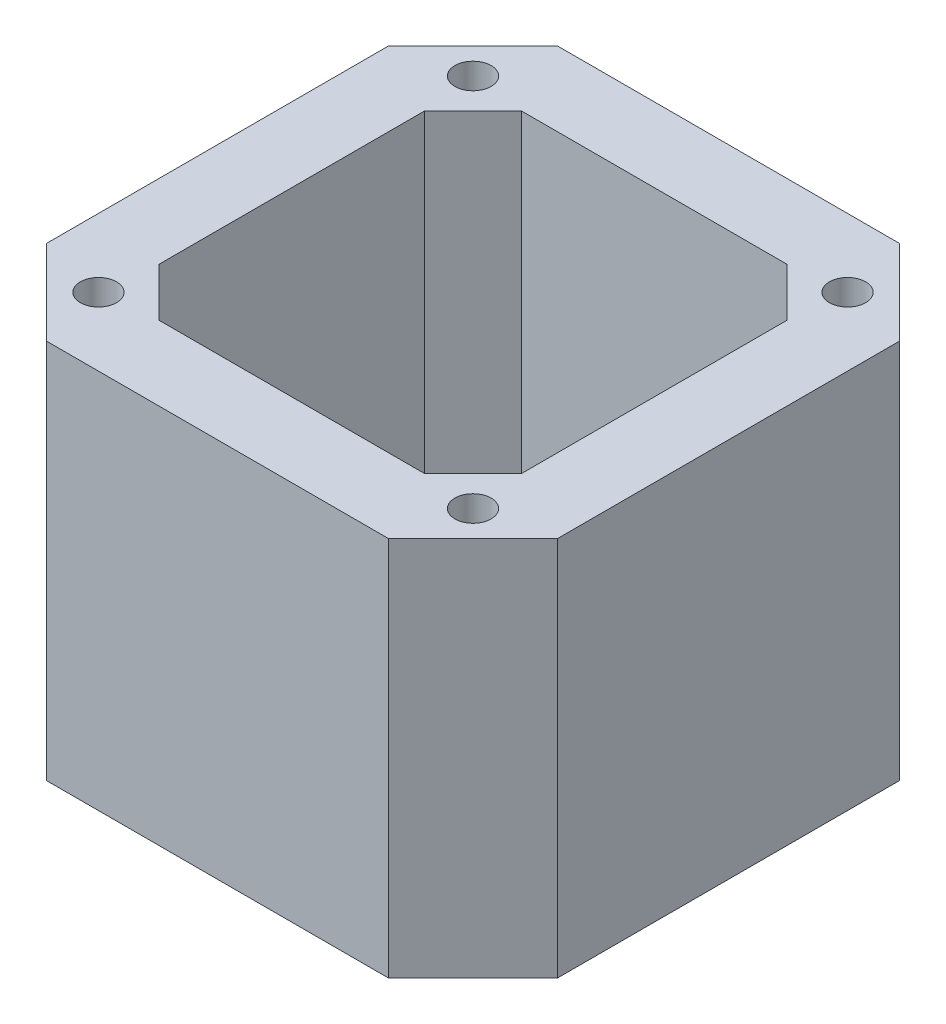
ISO-10303-21;
HEADER;
FILE_DESCRIPTION(('STEP AP214'),'2;1');
FILE_NAME('part.step','',(''),(''),'','','');
FILE_SCHEMA(('AUTOMOTIVE_DESIGN { 1 0 10303 214 1 1 1 1 }'));
ENDSEC;
DATA;
#1=APPLICATION_CONTEXT('core data for automotive mechanical design processes');
#2=APPLICATION_PROTOCOL_DEFINITION('international standard','automotive_design',2000,#1);
#3=PRODUCT_CONTEXT('',#1,'mechanical');
#4=PRODUCT('Part','Part','',(#3));
#5=PRODUCT_RELATED_PRODUCT_CATEGORY('part','',(#4));
#6=PRODUCT_DEFINITION_FORMATION('','',#4);
#7=PRODUCT_DEFINITION_CONTEXT('part definition',#1,'design');
#8=PRODUCT_DEFINITION('design','',#6,#7);
#9=PRODUCT_DEFINITION_SHAPE('','',#8);
#10=(LENGTH_UNIT() NAMED_UNIT(*) SI_UNIT(.MILLI.,.METRE.));
#11=(NAMED_UNIT(*) PLANE_ANGLE_UNIT() SI_UNIT($,.RADIAN.));
#12=(NAMED_UNIT(*) SI_UNIT($,.STERADIAN.) SOLID_ANGLE_UNIT());
#13=UNCERTAINTY_MEASURE_WITH_UNIT(LENGTH_MEASURE(1.E-05),#10,'distance_accuracy_value','');
#14=(GEOMETRIC_REPRESENTATION_CONTEXT(3) GLOBAL_UNCERTAINTY_ASSIGNED_CONTEXT((#13)) GLOBAL_UNIT_ASSIGNED_CONTEXT((#10,
#11,#12)) REPRESENTATION_CONTEXT('',''));
#15=CARTESIAN_POINT('',(0.,0.,0.));
#16=DIRECTION('',(0.,0.,1.));
#17=DIRECTION('',(1.,0.,0.));
#18=AXIS2_PLACEMENT_3D('',#15,#16,#17);
#19=CARTESIAN_POINT('',(-14.15,31.5,-21.15));
#20=DIRECTION('',(0.,0.,1.));
#21=DIRECTION('',(1.,0.,0.));
#22=AXIS2_PLACEMENT_3D('',#19,#20,#21);
#23=PLANE('',#22);
#24=DIRECTION('',(-1.,0.,0.));
#25=VECTOR('',#24,1.);
#26=CARTESIAN_POINT('',(-14.15,0.,-21.15));
#27=LINE('',#26,#25);
#28=CARTESIAN_POINT('',(14.15,0.,-21.15));
#29=VERTEX_POINT('',#28);
#30=CARTESIAN_POINT('',(-14.15,0.,-21.15));
#31=VERTEX_POINT('',#30);
#32=EDGE_CURVE('E219',#29,#31,#27,.T.);
#33=ORIENTED_EDGE('',*,*,#32,.T.);
#34=DIRECTION('',(0.,-1.,0.));
#35=VECTOR('',#34,1.);
#36=CARTESIAN_POINT('',(-14.15,31.5,-21.15));
#37=LINE('',#36,#35);
#38=CARTESIAN_POINT('',(-14.15,31.5,-21.15));
#39=VERTEX_POINT('',#38);
#40=EDGE_CURVE('E276',#39,#31,#37,.T.);
#41=ORIENTED_EDGE('',*,*,#40,.F.);
#42=DIRECTION('',(-1.,0.,0.));
#43=VECTOR('',#42,1.);
#44=CARTESIAN_POINT('',(-14.15,31.5,-21.15));
#45=LINE('',#44,#43);
#46=CARTESIAN_POINT('',(14.15,31.5,-21.15));
#47=VERTEX_POINT('',#46);
#48=EDGE_CURVE('E222',#47,#39,#45,.T.);
#49=ORIENTED_EDGE('',*,*,#48,.F.);
#50=DIRECTION('',(0.,-1.,0.));
#51=VECTOR('',#50,1.);
#52=CARTESIAN_POINT('',(14.15,31.5,-21.15));
#53=LINE('',#52,#51);
#54=EDGE_CURVE('E240',#47,#29,#53,.T.);
#55=ORIENTED_EDGE('',*,*,#54,.T.);
#56=EDGE_LOOP('',(#33,#41,#49,#55));
#57=FACE_BOUND('',#56,.T.);
#58=ADVANCED_FACE('F37',(#57),#23,.F.);
#59=CARTESIAN_POINT('',(-21.15,31.5,-14.15));
#60=DIRECTION('',(0.707106781186547,0.,0.707106781186547));
#61=DIRECTION('',(0.707106781186548,0.,-0.707106781186548));
#62=AXIS2_PLACEMENT_3D('',#59,#60,#61);
#63=PLANE('',#62);
#64=DIRECTION('',(-0.707106781186547,0.,0.707106781186547));
#65=VECTOR('',#64,1.);
#66=CARTESIAN_POINT('',(-21.15,0.,-14.15));
#67=LINE('',#66,#65);
#68=CARTESIAN_POINT('',(-21.15,0.,-14.15));
#69=VERTEX_POINT('',#68);
#70=EDGE_CURVE('E243',#31,#69,#67,.T.);
#71=ORIENTED_EDGE('',*,*,#70,.T.);
#72=DIRECTION('',(0.,-1.,0.));
#73=VECTOR('',#72,1.);
#74=CARTESIAN_POINT('',(-21.15,31.5,-14.15));
#75=LINE('',#74,#73);
#76=CARTESIAN_POINT('',(-21.15,31.5,-14.15));
#77=VERTEX_POINT('',#76);
#78=EDGE_CURVE('E273',#77,#69,#75,.T.);
#79=ORIENTED_EDGE('',*,*,#78,.F.);
#80=DIRECTION('',(-0.707106781186547,0.,0.707106781186547));
#81=VECTOR('',#80,1.);
#82=CARTESIAN_POINT('',(-21.15,31.5,-14.15));
#83=LINE('',#82,#81);
#84=EDGE_CURVE('E225',#39,#77,#83,.T.);
#85=ORIENTED_EDGE('',*,*,#84,.F.);
#86=ORIENTED_EDGE('',*,*,#40,.T.);
#87=EDGE_LOOP('',(#71,#79,#85,#86));
#88=FACE_BOUND('',#87,.T.);
#89=ADVANCED_FACE('F331',(#88),#63,.F.);
#90=CARTESIAN_POINT('',(-21.15,31.5,-14.15));
#91=DIRECTION('',(1.,0.,0.));
#92=DIRECTION('',(0.,0.,-1.));
#93=AXIS2_PLACEMENT_3D('',#90,#91,#92);
#94=PLANE('',#93);
#95=DIRECTION('',(0.,0.,1.));
#96=VECTOR('',#95,1.);
#97=CARTESIAN_POINT('',(-21.15,0.,-14.15));
#98=LINE('',#97,#96);
#99=CARTESIAN_POINT('',(-21.15,0.,14.15));
#100=VERTEX_POINT('',#99);
#101=EDGE_CURVE('E245',#69,#100,#98,.T.);
#102=ORIENTED_EDGE('',*,*,#101,.T.);
#103=DIRECTION('',(0.,-1.,0.));
#104=VECTOR('',#103,1.);
#105=CARTESIAN_POINT('',(-21.15,31.5,14.15));
#106=LINE('',#105,#104);
#107=CARTESIAN_POINT('',(-21.15,31.5,14.15));
#108=VERTEX_POINT('',#107);
#109=EDGE_CURVE('E270',#108,#100,#106,.T.);
#110=ORIENTED_EDGE('',*,*,#109,.F.);
#111=DIRECTION('',(0.,0.,1.));
#112=VECTOR('',#111,1.);
#113=CARTESIAN_POINT('',(-21.15,31.5,-14.15));
#114=LINE('',#113,#112);
#115=EDGE_CURVE('E228',#77,#108,#114,.T.);
#116=ORIENTED_EDGE('',*,*,#115,.F.);
#117=ORIENTED_EDGE('',*,*,#78,.T.);
#118=EDGE_LOOP('',(#102,#110,#116,#117));
#119=FACE_BOUND('',#118,.T.);
#120=ADVANCED_FACE('F336',(#119),#94,.F.);
#121=CARTESIAN_POINT('',(-21.15,31.5,14.15));
#122=DIRECTION('',(0.707106781186547,0.,-0.707106781186547));
#123=DIRECTION('',(-0.707106781186548,0.,-0.707106781186548));
#124=AXIS2_PLACEMENT_3D('',#121,#122,#123);
#125=PLANE('',#124);
#126=DIRECTION('',(0.707106781186547,0.,0.707106781186547));
#127=VECTOR('',#126,1.);
#128=CARTESIAN_POINT('',(-21.15,0.,14.15));
#129=LINE('',#128,#127);
#130=CARTESIAN_POINT('',(-14.15,0.,21.15));
#131=VERTEX_POINT('',#130);
#132=EDGE_CURVE('E247',#100,#131,#129,.T.);
#133=ORIENTED_EDGE('',*,*,#132,.T.);
#134=DIRECTION('',(0.,-1.,0.));
#135=VECTOR('',#134,1.);
#136=CARTESIAN_POINT('',(-14.15,31.5,21.15));
#137=LINE('',#136,#135);
#138=CARTESIAN_POINT('',(-14.15,31.5,21.15));
#139=VERTEX_POINT('',#138);
#140=EDGE_CURVE('E267',#139,#131,#137,.T.);
#141=ORIENTED_EDGE('',*,*,#140,.F.);
#142=DIRECTION('',(0.707106781186547,0.,0.707106781186547));
#143=VECTOR('',#142,1.);
#144=CARTESIAN_POINT('',(-21.15,31.5,14.15));
#145=LINE('',#144,#143);
#146=EDGE_CURVE('E230',#108,#139,#145,.T.);
#147=ORIENTED_EDGE('',*,*,#146,.F.);
#148=ORIENTED_EDGE('',*,*,#109,.T.);
#149=EDGE_LOOP('',(#133,#141,#147,#148));
#150=FACE_BOUND('',#149,.T.);
#151=ADVANCED_FACE('F369',(#150),#125,.F.);
#152=CARTESIAN_POINT('',(-14.15,31.5,21.15));
#153=DIRECTION('',(0.,0.,-1.));
#154=DIRECTION('',(-1.,0.,0.));
#155=AXIS2_PLACEMENT_3D('',#152,#153,#154);
#156=PLANE('',#155);
#157=DIRECTION('',(1.,0.,0.));
#158=VECTOR('',#157,1.);
#159=CARTESIAN_POINT('',(-14.15,0.,21.15));
#160=LINE('',#159,#158);
#161=CARTESIAN_POINT('',(14.15,0.,21.15));
#162=VERTEX_POINT('',#161);
#163=EDGE_CURVE('E249',#131,#162,#160,.T.);
#164=ORIENTED_EDGE('',*,*,#163,.T.);
#165=DIRECTION('',(0.,-1.,0.));
#166=VECTOR('',#165,1.);
#167=CARTESIAN_POINT('',(14.15,31.5,21.15));
#168=LINE('',#167,#166);
#169=CARTESIAN_POINT('',(14.15,31.5,21.15));
#170=VERTEX_POINT('',#169);
#171=EDGE_CURVE('E264',#170,#162,#168,.T.);
#172=ORIENTED_EDGE('',*,*,#171,.F.);
#173=DIRECTION('',(1.,0.,0.));
#174=VECTOR('',#173,1.);
#175=CARTESIAN_POINT('',(-14.15,31.5,21.15));
#176=LINE('',#175,#174);
#177=EDGE_CURVE('E232',#139,#170,#176,.T.);
#178=ORIENTED_EDGE('',*,*,#177,.F.);
#179=ORIENTED_EDGE('',*,*,#140,.T.);
#180=EDGE_LOOP('',(#164,#172,#178,#179));
#181=FACE_BOUND('',#180,.T.);
#182=ADVANCED_FACE('F365',(#181),#156,.F.);
#183=CARTESIAN_POINT('',(14.15,31.5,21.15));
#184=DIRECTION('',(-0.707106781186547,0.,-0.707106781186547));
#185=DIRECTION('',(-0.707106781186548,0.,0.707106781186548));
#186=AXIS2_PLACEMENT_3D('',#183,#184,#185);
#187=PLANE('',#186);
#188=DIRECTION('',(0.707106781186547,0.,-0.707106781186547));
#189=VECTOR('',#188,1.);
#190=CARTESIAN_POINT('',(14.15,0.,21.15));
#191=LINE('',#190,#189);
#192=CARTESIAN_POINT('',(21.15,0.,14.15));
#193=VERTEX_POINT('',#192);
#194=EDGE_CURVE('E251',#162,#193,#191,.T.);
#195=ORIENTED_EDGE('',*,*,#194,.T.);
#196=DIRECTION('',(0.,-1.,0.));
#197=VECTOR('',#196,1.);
#198=CARTESIAN_POINT('',(21.15,31.5,14.15));
#199=LINE('',#198,#197);
#200=CARTESIAN_POINT('',(21.15,31.5,14.15));
#201=VERTEX_POINT('',#200);
#202=EDGE_CURVE('E261',#201,#193,#199,.T.);
#203=ORIENTED_EDGE('',*,*,#202,.F.);
#204=DIRECTION('',(0.707106781186547,0.,-0.707106781186547));
#205=VECTOR('',#204,1.);
#206=CARTESIAN_POINT('',(14.15,31.5,21.15));
#207=LINE('',#206,#205);
#208=EDGE_CURVE('E234',#170,#201,#207,.T.);
#209=ORIENTED_EDGE('',*,*,#208,.F.);
#210=ORIENTED_EDGE('',*,*,#171,.T.);
#211=EDGE_LOOP('',(#195,#203,#209,#210));
#212=FACE_BOUND('',#211,.T.);
#213=ADVANCED_FACE('F360',(#212),#187,.F.);
#214=CARTESIAN_POINT('',(21.15,31.5,-14.15));
#215=DIRECTION('',(-1.,0.,0.));
#216=DIRECTION('',(0.,0.,1.));
#217=AXIS2_PLACEMENT_3D('',#214,#215,#216);
#218=PLANE('',#217);
#219=DIRECTION('',(0.,0.,-1.));
#220=VECTOR('',#219,1.);
#221=CARTESIAN_POINT('',(21.15,0.,-14.15));
#222=LINE('',#221,#220);
#223=CARTESIAN_POINT('',(21.15,0.,-14.15));
#224=VERTEX_POINT('',#223);
#225=EDGE_CURVE('E253',#193,#224,#222,.T.);
#226=ORIENTED_EDGE('',*,*,#225,.T.);
#227=DIRECTION('',(0.,-1.,0.));
#228=VECTOR('',#227,1.);
#229=CARTESIAN_POINT('',(21.15,31.5,-14.15));
#230=LINE('',#229,#228);
#231=CARTESIAN_POINT('',(21.15,31.5,-14.15));
#232=VERTEX_POINT('',#231);
#233=EDGE_CURVE('E258',#232,#224,#230,.T.);
#234=ORIENTED_EDGE('',*,*,#233,.F.);
#235=DIRECTION('',(0.,0.,-1.));
#236=VECTOR('',#235,1.);
#237=CARTESIAN_POINT('',(21.15,31.5,-14.15));
#238=LINE('',#237,#236);
#239=EDGE_CURVE('E236',#201,#232,#238,.T.);
#240=ORIENTED_EDGE('',*,*,#239,.F.);
#241=ORIENTED_EDGE('',*,*,#202,.T.);
#242=EDGE_LOOP('',(#226,#234,#240,#241));
#243=FACE_BOUND('',#242,.T.);
#244=ADVANCED_FACE('F355',(#243),#218,.F.);
#245=CARTESIAN_POINT('',(14.15,31.5,-21.15));
#246=DIRECTION('',(-0.707106781186547,0.,0.707106781186547));
#247=DIRECTION('',(0.707106781186548,0.,0.707106781186548));
#248=AXIS2_PLACEMENT_3D('',#245,#246,#247);
#249=PLANE('',#248);
#250=DIRECTION('',(-0.707106781186547,0.,-0.707106781186547));
#251=VECTOR('',#250,1.);
#252=CARTESIAN_POINT('',(14.15,0.,-21.15));
#253=LINE('',#252,#251);
#254=EDGE_CURVE('E226',#224,#29,#253,.T.);
#255=ORIENTED_EDGE('',*,*,#254,.T.);
#256=ORIENTED_EDGE('',*,*,#54,.F.);
#257=DIRECTION('',(-0.707106781186547,0.,-0.707106781186547));
#258=VECTOR('',#257,1.);
#259=CARTESIAN_POINT('',(14.15,31.5,-21.15));
#260=LINE('',#259,#258);
#261=EDGE_CURVE('E238',#232,#47,#260,.T.);
#262=ORIENTED_EDGE('',*,*,#261,.F.);
#263=ORIENTED_EDGE('',*,*,#233,.T.);
#264=EDGE_LOOP('',(#255,#256,#262,#263));
#265=FACE_BOUND('',#264,.T.);
#266=ADVANCED_FACE('F353',(#265),#249,.F.);
#267=CARTESIAN_POINT('',(0.,31.5,0.));
#268=DIRECTION('',(0.,-1.,0.));
#269=DIRECTION('',(0.,0.,-1.));
#270=AXIS2_PLACEMENT_3D('',#267,#268,#269);
#271=PLANE('',#270);
#272=DIRECTION('',(-0.707106781186548,0.,0.707106781186548));
#273=VECTOR('',#272,1.);
#274=CARTESIAN_POINT('',(-15.,31.5,-11.));
#275=LINE('',#274,#273);
#276=CARTESIAN_POINT('',(-11.,31.5,-15.));
#277=VERTEX_POINT('',#276);
#278=CARTESIAN_POINT('',(-15.,31.5,-11.));
#279=VERTEX_POINT('',#278);
#280=EDGE_CURVE('E160',#277,#279,#275,.T.);
#281=ORIENTED_EDGE('',*,*,#280,.F.);
#282=DIRECTION('',(-1.,0.,0.));
#283=VECTOR('',#282,1.);
#284=CARTESIAN_POINT('',(-11.,31.5,-15.));
#285=LINE('',#284,#283);
#286=CARTESIAN_POINT('',(11.,31.5,-15.));
#287=VERTEX_POINT('',#286);
#288=EDGE_CURVE('E51',#287,#277,#285,.T.);
#289=ORIENTED_EDGE('',*,*,#288,.F.);
#290=DIRECTION('',(-0.707106781186548,0.,-0.707106781186548));
#291=VECTOR('',#290,1.);
#292=CARTESIAN_POINT('',(11.,31.5,-15.));
#293=LINE('',#292,#291);
#294=CARTESIAN_POINT('',(15.,31.5,-11.));
#295=VERTEX_POINT('',#294);
#296=EDGE_CURVE('E182',#295,#287,#293,.T.);
#297=ORIENTED_EDGE('',*,*,#296,.F.);
#298=DIRECTION('',(0.,0.,-1.));
#299=VECTOR('',#298,1.);
#300=CARTESIAN_POINT('',(15.,31.5,-11.));
#301=LINE('',#300,#299);
#302=CARTESIAN_POINT('',(15.,31.5,11.));
#303=VERTEX_POINT('',#302);
#304=EDGE_CURVE('E179',#303,#295,#301,.T.);
#305=ORIENTED_EDGE('',*,*,#304,.F.);
#306=DIRECTION('',(0.707106781186548,0.,-0.707106781186548));
#307=VECTOR('',#306,1.);
#308=CARTESIAN_POINT('',(11.,31.5,15.));
#309=LINE('',#308,#307);
#310=CARTESIAN_POINT('',(11.,31.5,15.));
#311=VERTEX_POINT('',#310);
#312=EDGE_CURVE('E176',#311,#303,#309,.T.);
#313=ORIENTED_EDGE('',*,*,#312,.F.);
#314=DIRECTION('',(1.,0.,0.));
#315=VECTOR('',#314,1.);
#316=CARTESIAN_POINT('',(-11.,31.5,15.));
#317=LINE('',#316,#315);
#318=CARTESIAN_POINT('',(-11.,31.5,15.));
#319=VERTEX_POINT('',#318);
#320=EDGE_CURVE('E170',#319,#311,#317,.T.);
#321=ORIENTED_EDGE('',*,*,#320,.F.);
#322=DIRECTION('',(0.707106781186548,0.,0.707106781186548));
#323=VECTOR('',#322,1.);
#324=CARTESIAN_POINT('',(-15.,31.5,11.));
#325=LINE('',#324,#323);
#326=CARTESIAN_POINT('',(-15.,31.5,11.));
#327=VERTEX_POINT('',#326);
#328=EDGE_CURVE('E168',#327,#319,#325,.T.);
#329=ORIENTED_EDGE('',*,*,#328,.F.);
#330=DIRECTION('',(0.,0.,1.));
#331=VECTOR('',#330,1.);
#332=CARTESIAN_POINT('',(-15.,31.5,-11.));
#333=LINE('',#332,#331);
#334=EDGE_CURVE('E151',#279,#327,#333,.T.);
#335=ORIENTED_EDGE('',*,*,#334,.F.);
#336=EDGE_LOOP('',(#281,#289,#297,#305,#313,#321,#329,#335));
#337=FACE_BOUND('',#336,.T.);
#338=CARTESIAN_POINT('',(15.5,31.5,-15.5));
#339=DIRECTION('',(0.,1.,0.));
#340=DIRECTION('',(0.,0.,1.));
#341=AXIS2_PLACEMENT_3D('',#338,#339,#340);
#342=CIRCLE('',#341,1.5);
#343=CARTESIAN_POINT('',(15.5,31.5,-14.));
#344=VERTEX_POINT('',#343);
#345=EDGE_CURVE('E208',#344,#344,#342,.T.);
#346=ORIENTED_EDGE('',*,*,#345,.F.);
#347=EDGE_LOOP('',(#346));
#348=FACE_BOUND('',#347,.T.);
#349=CARTESIAN_POINT('',(-15.5,31.5,15.5));
#350=DIRECTION('',(0.,1.,0.));
#351=DIRECTION('',(0.,0.,1.));
#352=AXIS2_PLACEMENT_3D('',#349,#350,#351);
#353=CIRCLE('',#352,1.5);
#354=CARTESIAN_POINT('',(-15.5,31.5,17.));
#355=VERTEX_POINT('',#354);
#356=EDGE_CURVE('E201',#355,#355,#353,.T.);
#357=ORIENTED_EDGE('',*,*,#356,.F.);
#358=EDGE_LOOP('',(#357));
#359=FACE_BOUND('',#358,.T.);
#360=CARTESIAN_POINT('',(15.5,31.5,15.5));
#361=DIRECTION('',(0.,1.,0.));
#362=DIRECTION('',(0.,0.,1.));
#363=AXIS2_PLACEMENT_3D('',#360,#361,#362);
#364=CIRCLE('',#363,1.5);
#365=CARTESIAN_POINT('',(15.5,31.5,17.));
#366=VERTEX_POINT('',#365);
#367=EDGE_CURVE('E187',#366,#366,#364,.T.);
#368=ORIENTED_EDGE('',*,*,#367,.F.);
#369=EDGE_LOOP('',(#368));
#370=FACE_BOUND('',#369,.T.);
#371=CARTESIAN_POINT('',(-15.5,31.5,-15.5));
#372=DIRECTION('',(0.,1.,0.));
#373=DIRECTION('',(0.,0.,1.));
#374=AXIS2_PLACEMENT_3D('',#371,#372,#373);
#375=CIRCLE('',#374,1.5);
#376=CARTESIAN_POINT('',(-15.5,31.5,-14.));
#377=VERTEX_POINT('',#376);
#378=EDGE_CURVE('E207',#377,#377,#375,.T.);
#379=ORIENTED_EDGE('',*,*,#378,.F.);
#380=EDGE_LOOP('',(#379));
#381=FACE_BOUND('',#380,.T.);
#382=ORIENTED_EDGE('',*,*,#48,.T.);
#383=ORIENTED_EDGE('',*,*,#84,.T.);
#384=ORIENTED_EDGE('',*,*,#115,.T.);
#385=ORIENTED_EDGE('',*,*,#146,.T.);
#386=ORIENTED_EDGE('',*,*,#177,.T.);
#387=ORIENTED_EDGE('',*,*,#208,.T.);
#388=ORIENTED_EDGE('',*,*,#239,.T.);
#389=ORIENTED_EDGE('',*,*,#261,.T.);
#390=EDGE_LOOP('',(#382,#383,#384,#385,#386,#387,#388,#389));
#391=FACE_BOUND('',#390,.T.);
#392=ADVANCED_FACE('F164',(#337,#348,#359,#370,#381,#391),#271,.F.);
#393=CARTESIAN_POINT('',(0.,0.,0.));
#394=DIRECTION('',(0.,-1.,0.));
#395=DIRECTION('',(0.,0.,-1.));
#396=AXIS2_PLACEMENT_3D('',#393,#394,#395);
#397=PLANE('',#396);
#398=DIRECTION('',(1.,0.,0.));
#399=VECTOR('',#398,1.);
#400=CARTESIAN_POINT('',(0.,0.,-15.));
#401=LINE('',#400,#399);
#402=CARTESIAN_POINT('',(-11.,0.,-15.));
#403=VERTEX_POINT('',#402);
#404=CARTESIAN_POINT('',(11.,0.,-15.));
#405=VERTEX_POINT('',#404);
#406=EDGE_CURVE('E11',#403,#405,#401,.T.);
#407=ORIENTED_EDGE('',*,*,#406,.F.);
#408=DIRECTION('',(0.707106781186548,0.,-0.707106781186548));
#409=VECTOR('',#408,1.);
#410=CARTESIAN_POINT('',(-13.,0.,-13.));
#411=LINE('',#410,#409);
#412=CARTESIAN_POINT('',(-15.,0.,-11.));
#413=VERTEX_POINT('',#412);
#414=EDGE_CURVE('E279',#413,#403,#411,.T.);
#415=ORIENTED_EDGE('',*,*,#414,.F.);
#416=DIRECTION('',(0.,0.,-1.));
#417=VECTOR('',#416,1.);
#418=CARTESIAN_POINT('',(-15.,0.,0.));
#419=LINE('',#418,#417);
#420=CARTESIAN_POINT('',(-15.,0.,11.));
#421=VERTEX_POINT('',#420);
#422=EDGE_CURVE('E154',#421,#413,#419,.T.);
#423=ORIENTED_EDGE('',*,*,#422,.F.);
#424=DIRECTION('',(-0.707106781186548,0.,-0.707106781186548));
#425=VECTOR('',#424,1.);
#426=CARTESIAN_POINT('',(-13.,0.,13.));
#427=LINE('',#426,#425);
#428=CARTESIAN_POINT('',(-11.,0.,15.));
#429=VERTEX_POINT('',#428);
#430=EDGE_CURVE('E282',#429,#421,#427,.T.);
#431=ORIENTED_EDGE('',*,*,#430,.F.);
#432=DIRECTION('',(-1.,0.,0.));
#433=VECTOR('',#432,1.);
#434=CARTESIAN_POINT('',(0.,0.,15.));
#435=LINE('',#434,#433);
#436=CARTESIAN_POINT('',(11.,0.,15.));
#437=VERTEX_POINT('',#436);
#438=EDGE_CURVE('E284',#437,#429,#435,.T.);
#439=ORIENTED_EDGE('',*,*,#438,.F.);
#440=DIRECTION('',(-0.707106781186548,0.,0.707106781186548));
#441=VECTOR('',#440,1.);
#442=CARTESIAN_POINT('',(13.,0.,13.));
#443=LINE('',#442,#441);
#444=CARTESIAN_POINT('',(15.,0.,11.));
#445=VERTEX_POINT('',#444);
#446=EDGE_CURVE('E286',#445,#437,#443,.T.);
#447=ORIENTED_EDGE('',*,*,#446,.F.);
#448=DIRECTION('',(0.,0.,1.));
#449=VECTOR('',#448,1.);
#450=CARTESIAN_POINT('',(15.,0.,0.));
#451=LINE('',#450,#449);
#452=CARTESIAN_POINT('',(15.,0.,-11.));
#453=VERTEX_POINT('',#452);
#454=EDGE_CURVE('E288',#453,#445,#451,.T.);
#455=ORIENTED_EDGE('',*,*,#454,.F.);
#456=DIRECTION('',(0.707106781186548,0.,0.707106781186548));
#457=VECTOR('',#456,1.);
#458=CARTESIAN_POINT('',(13.,0.,-13.));
#459=LINE('',#458,#457);
#460=EDGE_CURVE('E44',#405,#453,#459,.T.);
#461=ORIENTED_EDGE('',*,*,#460,.F.);
#462=EDGE_LOOP('',(#407,#415,#423,#431,#439,#447,#455,#461));
#463=FACE_BOUND('',#462,.T.);
#464=ORIENTED_EDGE('',*,*,#32,.F.);
#465=ORIENTED_EDGE('',*,*,#254,.F.);
#466=ORIENTED_EDGE('',*,*,#225,.F.);
#467=ORIENTED_EDGE('',*,*,#194,.F.);
#468=ORIENTED_EDGE('',*,*,#163,.F.);
#469=ORIENTED_EDGE('',*,*,#132,.F.);
#470=ORIENTED_EDGE('',*,*,#101,.F.);
#471=ORIENTED_EDGE('',*,*,#70,.F.);
#472=EDGE_LOOP('',(#464,#465,#466,#467,#468,#469,#470,#471));
#473=FACE_BOUND('',#472,.T.);
#474=ADVANCED_FACE('F303',(#463,#473),#397,.T.);
#475=CARTESIAN_POINT('',(-15.5,26.5,-15.5));
#476=DIRECTION('',(0.,1.,0.));
#477=DIRECTION('',(0.,0.,1.));
#478=AXIS2_PLACEMENT_3D('',#475,#476,#477);
#479=CYLINDRICAL_SURFACE('',#478,1.5);
#480=CARTESIAN_POINT('',(-15.5,26.5,-15.5));
#481=DIRECTION('',(0.,1.,0.));
#482=DIRECTION('',(0.,0.,1.));
#483=AXIS2_PLACEMENT_3D('',#480,#481,#482);
#484=CIRCLE('',#483,1.5);
#485=CARTESIAN_POINT('',(-15.5,26.5,-14.));
#486=VERTEX_POINT('',#485);
#487=EDGE_CURVE('E216',#486,#486,#484,.T.);
#488=ORIENTED_EDGE('',*,*,#487,.F.);
#489=EDGE_LOOP('',(#488));
#490=FACE_BOUND('',#489,.T.);
#491=ORIENTED_EDGE('',*,*,#378,.T.);
#492=EDGE_LOOP('',(#491));
#493=FACE_BOUND('',#492,.T.);
#494=ADVANCED_FACE('F389',(#490,#493),#479,.F.);
#495=CARTESIAN_POINT('',(-15.5,26.5,-15.5));
#496=DIRECTION('',(0.,1.,0.));
#497=DIRECTION('',(0.,0.,1.));
#498=AXIS2_PLACEMENT_3D('',#495,#496,#497);
#499=PLANE('',#498);
#500=ORIENTED_EDGE('',*,*,#487,.T.);
#501=EDGE_LOOP('',(#500));
#502=FACE_BOUND('',#501,.T.);
#503=ADVANCED_FACE('F394',(#502),#499,.T.);
#504=CARTESIAN_POINT('',(15.5,26.5,15.5));
#505=DIRECTION('',(0.,1.,0.));
#506=DIRECTION('',(0.,0.,1.));
#507=AXIS2_PLACEMENT_3D('',#504,#505,#506);
#508=CYLINDRICAL_SURFACE('',#507,1.5);
#509=CARTESIAN_POINT('',(15.5,26.5,15.5));
#510=DIRECTION('',(0.,1.,0.));
#511=DIRECTION('',(0.,0.,1.));
#512=AXIS2_PLACEMENT_3D('',#509,#510,#511);
#513=CIRCLE('',#512,1.5);
#514=CARTESIAN_POINT('',(15.5,26.5,17.));
#515=VERTEX_POINT('',#514);
#516=EDGE_CURVE('E198',#515,#515,#513,.T.);
#517=ORIENTED_EDGE('',*,*,#516,.F.);
#518=EDGE_LOOP('',(#517));
#519=FACE_BOUND('',#518,.T.);
#520=ORIENTED_EDGE('',*,*,#367,.T.);
#521=EDGE_LOOP('',(#520));
#522=FACE_BOUND('',#521,.T.);
#523=ADVANCED_FACE('F398',(#519,#522),#508,.F.);
#524=CARTESIAN_POINT('',(15.5,26.5,15.5));
#525=DIRECTION('',(0.,1.,0.));
#526=DIRECTION('',(0.,0.,1.));
#527=AXIS2_PLACEMENT_3D('',#524,#525,#526);
#528=PLANE('',#527);
#529=ORIENTED_EDGE('',*,*,#516,.T.);
#530=EDGE_LOOP('',(#529));
#531=FACE_BOUND('',#530,.T.);
#532=ADVANCED_FACE('F404',(#531),#528,.T.);
#533=CARTESIAN_POINT('',(-15.5,26.5,15.5));
#534=DIRECTION('',(0.,1.,0.));
#535=DIRECTION('',(0.,0.,1.));
#536=AXIS2_PLACEMENT_3D('',#533,#534,#535);
#537=CYLINDRICAL_SURFACE('',#536,1.5);
#538=CARTESIAN_POINT('',(-15.5,26.5,15.5));
#539=DIRECTION('',(0.,1.,0.));
#540=DIRECTION('',(0.,0.,1.));
#541=AXIS2_PLACEMENT_3D('',#538,#539,#540);
#542=CIRCLE('',#541,1.5);
#543=CARTESIAN_POINT('',(-15.5,26.5,17.));
#544=VERTEX_POINT('',#543);
#545=EDGE_CURVE('E211',#544,#544,#542,.T.);
#546=ORIENTED_EDGE('',*,*,#545,.F.);
#547=EDGE_LOOP('',(#546));
#548=FACE_BOUND('',#547,.T.);
#549=ORIENTED_EDGE('',*,*,#356,.T.);
#550=EDGE_LOOP('',(#549));
#551=FACE_BOUND('',#550,.T.);
#552=ADVANCED_FACE('F400',(#548,#551),#537,.F.);
#553=CARTESIAN_POINT('',(-15.5,26.5,15.5));
#554=DIRECTION('',(0.,1.,0.));
#555=DIRECTION('',(0.,0.,1.));
#556=AXIS2_PLACEMENT_3D('',#553,#554,#555);
#557=PLANE('',#556);
#558=ORIENTED_EDGE('',*,*,#545,.T.);
#559=EDGE_LOOP('',(#558));
#560=FACE_BOUND('',#559,.T.);
#561=ADVANCED_FACE('F403',(#560),#557,.T.);
#562=CARTESIAN_POINT('',(15.5,26.5,-15.5));
#563=DIRECTION('',(0.,1.,0.));
#564=DIRECTION('',(0.,0.,1.));
#565=AXIS2_PLACEMENT_3D('',#562,#563,#564);
#566=CYLINDRICAL_SURFACE('',#565,1.5);
#567=CARTESIAN_POINT('',(15.5,26.5,-15.5));
#568=DIRECTION('',(0.,1.,0.));
#569=DIRECTION('',(0.,0.,1.));
#570=AXIS2_PLACEMENT_3D('',#567,#568,#569);
#571=CIRCLE('',#570,1.5);
#572=CARTESIAN_POINT('',(15.5,26.5,-14.));
#573=VERTEX_POINT('',#572);
#574=EDGE_CURVE('E204',#573,#573,#571,.T.);
#575=ORIENTED_EDGE('',*,*,#574,.F.);
#576=EDGE_LOOP('',(#575));
#577=FACE_BOUND('',#576,.T.);
#578=ORIENTED_EDGE('',*,*,#345,.T.);
#579=EDGE_LOOP('',(#578));
#580=FACE_BOUND('',#579,.T.);
#581=ADVANCED_FACE('F325',(#577,#580),#566,.F.);
#582=CARTESIAN_POINT('',(15.5,26.5,-15.5));
#583=DIRECTION('',(0.,1.,0.));
#584=DIRECTION('',(0.,0.,1.));
#585=AXIS2_PLACEMENT_3D('',#582,#583,#584);
#586=PLANE('',#585);
#587=ORIENTED_EDGE('',*,*,#574,.T.);
#588=EDGE_LOOP('',(#587));
#589=FACE_BOUND('',#588,.T.);
#590=ADVANCED_FACE('F318',(#589),#586,.T.);
#591=CARTESIAN_POINT('',(-11.,-13.5,-15.));
#592=DIRECTION('',(0.,0.,-1.));
#593=DIRECTION('',(-1.,0.,0.));
#594=AXIS2_PLACEMENT_3D('',#591,#592,#593);
#595=PLANE('',#594);
#596=ORIENTED_EDGE('',*,*,#406,.T.);
#597=DIRECTION('',(0.,1.,0.));
#598=VECTOR('',#597,1.);
#599=CARTESIAN_POINT('',(11.,-13.5,-15.));
#600=LINE('',#599,#598);
#601=EDGE_CURVE('E185',#405,#287,#600,.T.);
#602=ORIENTED_EDGE('',*,*,#601,.T.);
#603=ORIENTED_EDGE('',*,*,#288,.T.);
#604=DIRECTION('',(0.,1.,0.));
#605=VECTOR('',#604,1.);
#606=CARTESIAN_POINT('',(-11.,-13.5,-15.));
#607=LINE('',#606,#605);
#608=EDGE_CURVE('E157',#403,#277,#607,.T.);
#609=ORIENTED_EDGE('',*,*,#608,.F.);
#610=EDGE_LOOP('',(#596,#602,#603,#609));
#611=FACE_BOUND('',#610,.T.);
#612=ADVANCED_FACE('F316',(#611),#595,.F.);
#613=CARTESIAN_POINT('',(11.,-13.5,-15.));
#614=DIRECTION('',(0.707106781186547,0.,-0.707106781186547));
#615=DIRECTION('',(-0.707106781186548,0.,-0.707106781186548));
#616=AXIS2_PLACEMENT_3D('',#613,#614,#615);
#617=PLANE('',#616);
#618=ORIENTED_EDGE('',*,*,#460,.T.);
#619=DIRECTION('',(0.,1.,0.));
#620=VECTOR('',#619,1.);
#621=CARTESIAN_POINT('',(15.,-13.5,-11.));
#622=LINE('',#621,#620);
#623=EDGE_CURVE('E188',#453,#295,#622,.T.);
#624=ORIENTED_EDGE('',*,*,#623,.T.);
#625=ORIENTED_EDGE('',*,*,#296,.T.);
#626=ORIENTED_EDGE('',*,*,#601,.F.);
#627=EDGE_LOOP('',(#618,#624,#625,#626));
#628=FACE_BOUND('',#627,.T.);
#629=ADVANCED_FACE('F293',(#628),#617,.F.);
#630=CARTESIAN_POINT('',(15.,-13.5,-11.));
#631=DIRECTION('',(1.,0.,0.));
#632=DIRECTION('',(0.,0.,-1.));
#633=AXIS2_PLACEMENT_3D('',#630,#631,#632);
#634=PLANE('',#633);
#635=ORIENTED_EDGE('',*,*,#454,.T.);
#636=DIRECTION('',(0.,1.,0.));
#637=VECTOR('',#636,1.);
#638=CARTESIAN_POINT('',(15.,-13.5,11.));
#639=LINE('',#638,#637);
#640=EDGE_CURVE('E190',#445,#303,#639,.T.);
#641=ORIENTED_EDGE('',*,*,#640,.T.);
#642=ORIENTED_EDGE('',*,*,#304,.T.);
#643=ORIENTED_EDGE('',*,*,#623,.F.);
#644=EDGE_LOOP('',(#635,#641,#642,#643));
#645=FACE_BOUND('',#644,.T.);
#646=ADVANCED_FACE('F298',(#645),#634,.F.);
#647=CARTESIAN_POINT('',(11.,-13.5,15.));
#648=DIRECTION('',(0.707106781186547,0.,0.707106781186547));
#649=DIRECTION('',(0.707106781186548,0.,-0.707106781186548));
#650=AXIS2_PLACEMENT_3D('',#647,#648,#649);
#651=PLANE('',#650);
#652=ORIENTED_EDGE('',*,*,#446,.T.);
#653=DIRECTION('',(0.,1.,0.));
#654=VECTOR('',#653,1.);
#655=CARTESIAN_POINT('',(11.,-13.5,15.));
#656=LINE('',#655,#654);
#657=EDGE_CURVE('E192',#437,#311,#656,.T.);
#658=ORIENTED_EDGE('',*,*,#657,.T.);
#659=ORIENTED_EDGE('',*,*,#312,.T.);
#660=ORIENTED_EDGE('',*,*,#640,.F.);
#661=EDGE_LOOP('',(#652,#658,#659,#660));
#662=FACE_BOUND('',#661,.T.);
#663=ADVANCED_FACE('F309',(#662),#651,.F.);
#664=CARTESIAN_POINT('',(-11.,-13.5,15.));
#665=DIRECTION('',(0.,0.,1.));
#666=DIRECTION('',(1.,0.,0.));
#667=AXIS2_PLACEMENT_3D('',#664,#665,#666);
#668=PLANE('',#667);
#669=ORIENTED_EDGE('',*,*,#438,.T.);
#670=DIRECTION('',(0.,1.,0.));
#671=VECTOR('',#670,1.);
#672=CARTESIAN_POINT('',(-11.,-13.5,15.));
#673=LINE('',#672,#671);
#674=EDGE_CURVE('E194',#429,#319,#673,.T.);
#675=ORIENTED_EDGE('',*,*,#674,.T.);
#676=ORIENTED_EDGE('',*,*,#320,.T.);
#677=ORIENTED_EDGE('',*,*,#657,.F.);
#678=EDGE_LOOP('',(#669,#675,#676,#677));
#679=FACE_BOUND('',#678,.T.);
#680=ADVANCED_FACE('F311',(#679),#668,.F.);
#681=CARTESIAN_POINT('',(-15.,-13.5,11.));
#682=DIRECTION('',(-0.707106781186547,0.,0.707106781186547));
#683=DIRECTION('',(0.707106781186548,0.,0.707106781186548));
#684=AXIS2_PLACEMENT_3D('',#681,#682,#683);
#685=PLANE('',#684);
#686=ORIENTED_EDGE('',*,*,#430,.T.);
#687=DIRECTION('',(0.,1.,0.));
#688=VECTOR('',#687,1.);
#689=CARTESIAN_POINT('',(-15.,-13.5,11.));
#690=LINE('',#689,#688);
#691=EDGE_CURVE('E156',#421,#327,#690,.T.);
#692=ORIENTED_EDGE('',*,*,#691,.T.);
#693=ORIENTED_EDGE('',*,*,#328,.T.);
#694=ORIENTED_EDGE('',*,*,#674,.F.);
#695=EDGE_LOOP('',(#686,#692,#693,#694));
#696=FACE_BOUND('',#695,.T.);
#697=ADVANCED_FACE('F315',(#696),#685,.F.);
#698=CARTESIAN_POINT('',(-15.,-13.5,-11.));
#699=DIRECTION('',(-1.,0.,0.));
#700=DIRECTION('',(0.,0.,1.));
#701=AXIS2_PLACEMENT_3D('',#698,#699,#700);
#702=PLANE('',#701);
#703=ORIENTED_EDGE('',*,*,#422,.T.);
#704=DIRECTION('',(0.,1.,0.));
#705=VECTOR('',#704,1.);
#706=CARTESIAN_POINT('',(-15.,-13.5,-11.));
#707=LINE('',#706,#705);
#708=EDGE_CURVE('E59',#413,#279,#707,.T.);
#709=ORIENTED_EDGE('',*,*,#708,.T.);
#710=ORIENTED_EDGE('',*,*,#334,.T.);
#711=ORIENTED_EDGE('',*,*,#691,.F.);
#712=EDGE_LOOP('',(#703,#709,#710,#711));
#713=FACE_BOUND('',#712,.T.);
#714=ADVANCED_FACE('F148',(#713),#702,.F.);
#715=CARTESIAN_POINT('',(-15.,-13.5,-11.));
#716=DIRECTION('',(-0.707106781186547,0.,-0.707106781186547));
#717=DIRECTION('',(-0.707106781186548,0.,0.707106781186548));
#718=AXIS2_PLACEMENT_3D('',#715,#716,#717);
#719=PLANE('',#718);
#720=ORIENTED_EDGE('',*,*,#414,.T.);
#721=ORIENTED_EDGE('',*,*,#608,.T.);
#722=ORIENTED_EDGE('',*,*,#280,.T.);
#723=ORIENTED_EDGE('',*,*,#708,.F.);
#724=EDGE_LOOP('',(#720,#721,#722,#723));
#725=FACE_BOUND('',#724,.T.);
#726=ADVANCED_FACE('F161',(#725),#719,.F.);
#727=CLOSED_SHELL('',(#58,#89,#120,#151,#182,#213,#244,#266,#392,#474,#494,#503,#523,#532,#552,
#561,#581,#590,#612,#629,#646,#663,#680,#697,#714,#726));
#728=MANIFOLD_SOLID_BREP('B2',#727);
#729=ADVANCED_BREP_SHAPE_REPRESENTATION('',(#18,#728),#14);
#730=SHAPE_DEFINITION_REPRESENTATION(#9,#729);
ENDSEC;
END-ISO-10303-21;
